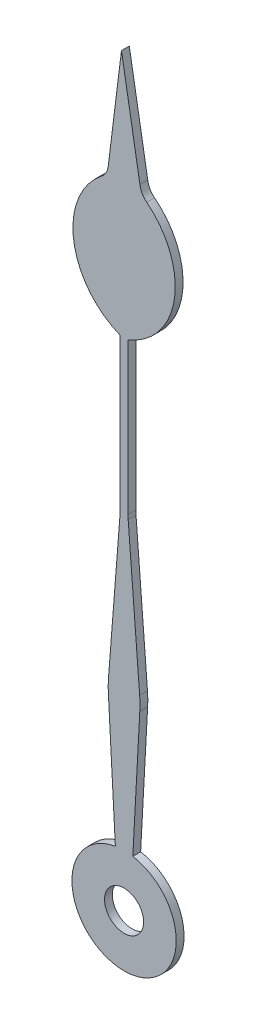
ISO-10303-21;
HEADER;
FILE_DESCRIPTION(('STEP AP214'),'2;1');
FILE_NAME('part.step','',(''),(''),'','','');
FILE_SCHEMA(('AUTOMOTIVE_DESIGN { 1 0 10303 214 1 1 1 1 }'));
ENDSEC;
DATA;
#1=APPLICATION_CONTEXT('core data for automotive mechanical design processes');
#2=APPLICATION_PROTOCOL_DEFINITION('international standard','automotive_design',2000,#1);
#3=PRODUCT_CONTEXT('',#1,'mechanical');
#4=PRODUCT('Part','Part','',(#3));
#5=PRODUCT_RELATED_PRODUCT_CATEGORY('part','',(#4));
#6=PRODUCT_DEFINITION_FORMATION('','',#4);
#7=PRODUCT_DEFINITION_CONTEXT('part definition',#1,'design');
#8=PRODUCT_DEFINITION('design','',#6,#7);
#9=PRODUCT_DEFINITION_SHAPE('','',#8);
#10=(LENGTH_UNIT() NAMED_UNIT(*) SI_UNIT(.MILLI.,.METRE.));
#11=(NAMED_UNIT(*) PLANE_ANGLE_UNIT() SI_UNIT($,.RADIAN.));
#12=(NAMED_UNIT(*) SI_UNIT($,.STERADIAN.) SOLID_ANGLE_UNIT());
#13=UNCERTAINTY_MEASURE_WITH_UNIT(LENGTH_MEASURE(1.E-05),#10,'distance_accuracy_value','');
#14=(GEOMETRIC_REPRESENTATION_CONTEXT(3) GLOBAL_UNCERTAINTY_ASSIGNED_CONTEXT((#13)) GLOBAL_UNIT_ASSIGNED_CONTEXT((#10,
#11,#12)) REPRESENTATION_CONTEXT('',''));
#15=CARTESIAN_POINT('',(0.,0.,0.));
#16=DIRECTION('',(0.,0.,1.));
#17=DIRECTION('',(1.,0.,0.));
#18=AXIS2_PLACEMENT_3D('',#15,#16,#17);
#19=CARTESIAN_POINT('',(0.,0.,0.3));
#20=DIRECTION('',(0.,0.,1.));
#21=DIRECTION('',(1.,0.,0.));
#22=AXIS2_PLACEMENT_3D('',#19,#20,#21);
#23=PLANE('',#22);
#24=CARTESIAN_POINT('',(0.,0.,0.3));
#25=DIRECTION('',(0.,0.,1.));
#26=DIRECTION('',(1.,0.,0.));
#27=AXIS2_PLACEMENT_3D('',#24,#25,#26);
#28=CIRCLE('',#27,2.);
#29=CARTESIAN_POINT('',(-0.33432381716244,1.9718589161697,0.3));
#30=VERTEX_POINT('',#29);
#31=CARTESIAN_POINT('',(0.33432381716244,1.9718589161697,0.3));
#32=VERTEX_POINT('',#31);
#33=EDGE_CURVE('E216',#30,#32,#28,.T.);
#34=ORIENTED_EDGE('',*,*,#33,.T.);
#35=DIRECTION('',(0.0542131918948308,0.998529383555924,0.));
#36=VECTOR('',#35,1.);
#37=CARTESIAN_POINT('',(0.33432381716244,1.9718589161697,0.3));
#38=LINE('',#37,#36);
#39=CARTESIAN_POINT('',(0.602966855412922,6.9198790936428,0.3));
#40=VERTEX_POINT('',#39);
#41=EDGE_CURVE('E119',#32,#40,#38,.T.);
#42=ORIENTED_EDGE('',*,*,#41,.T.);
#43=CARTESIAN_POINT('',(-3.39115067881078,7.13673186122212,0.3));
#44=DIRECTION('',(0.,0.,1.));
#45=DIRECTION('',(1.,0.,0.));
#46=AXIS2_PLACEMENT_3D('',#43,#44,#45);
#47=CIRCLE('',#46,4.);
#48=CARTESIAN_POINT('',(0.596611596726553,7.4493850777438,0.3));
#49=VERTEX_POINT('',#48);
#50=EDGE_CURVE('E258',#40,#49,#47,.T.);
#51=ORIENTED_EDGE('',*,*,#50,.T.);
#52=DIRECTION('',(-0.0781633041304199,0.996940568884332,0.));
#53=VECTOR('',#52,1.);
#54=CARTESIAN_POINT('',(0.596611596726553,7.4493850777438,0.3));
#55=LINE('',#54,#53);
#56=CARTESIAN_POINT('',(0.156118862231336,13.0676874538094,0.3));
#57=VERTEX_POINT('',#56);
#58=EDGE_CURVE('E277',#49,#57,#55,.T.);
#59=ORIENTED_EDGE('',*,*,#58,.T.);
#60=CARTESIAN_POINT('',(2.15,13.2240140620702,0.3));
#61=DIRECTION('',(0.,0.,-1.));
#62=DIRECTION('',(-1.,0.,0.));
#63=AXIS2_PLACEMENT_3D('',#60,#61,#62);
#64=CIRCLE('',#63,2.);
#65=CARTESIAN_POINT('',(0.15,13.2240140620702,0.3));
#66=VERTEX_POINT('',#65);
#67=EDGE_CURVE('E274',#57,#66,#64,.T.);
#68=ORIENTED_EDGE('',*,*,#67,.T.);
#69=DIRECTION('',(0.,1.,0.));
#70=VECTOR('',#69,1.);
#71=CARTESIAN_POINT('',(0.15,13.2240140620702,0.3));
#72=LINE('',#71,#70);
#73=CARTESIAN_POINT('',(0.149999999999999,19.0263409535599,0.3));
#74=VERTEX_POINT('',#73);
#75=EDGE_CURVE('E276',#66,#74,#72,.T.);
#76=ORIENTED_EDGE('',*,*,#75,.T.);
#77=CARTESIAN_POINT('',(-0.91243211149733,21.6960404063613,0.3));
#78=DIRECTION('',(0.,0.,1.));
#79=DIRECTION('',(1.,0.,0.));
#80=AXIS2_PLACEMENT_3D('',#77,#78,#79);
#81=CIRCLE('',#80,2.87333554598641);
#82=CARTESIAN_POINT('',(0.868120306497028,23.9511879063274,0.3));
#83=VERTEX_POINT('',#82);
#84=EDGE_CURVE('E279',#74,#83,#81,.T.);
#85=ORIENTED_EDGE('',*,*,#84,.T.);
#86=CARTESIAN_POINT('',(1.30189724366577,24.5005853660781,0.3));
#87=DIRECTION('',(0.,0.,-1.));
#88=DIRECTION('',(-1.,0.,0.));
#89=AXIS2_PLACEMENT_3D('',#86,#87,#88);
#90=CIRCLE('',#89,0.700000000000001);
#91=CARTESIAN_POINT('',(0.607202000046279,24.4145707249264,0.3));
#92=VERTEX_POINT('',#91);
#93=EDGE_CURVE('E285',#83,#92,#90,.T.);
#94=ORIENTED_EDGE('',*,*,#93,.T.);
#95=DIRECTION('',(-0.170467966477735,0.985363218516373,0.));
#96=VECTOR('',#95,1.);
#97=CARTESIAN_POINT('',(0.607202000046279,24.4145707249264,0.3));
#98=LINE('',#97,#96);
#99=CARTESIAN_POINT('',(-0.100615971359812,28.5060009733158,0.3));
#100=VERTEX_POINT('',#99);
#101=EDGE_CURVE('E287',#92,#100,#98,.T.);
#102=ORIENTED_EDGE('',*,*,#101,.T.);
#103=DIRECTION('',(-0.122878058788195,-0.992421776599267,0.));
#104=VECTOR('',#103,1.);
#105=CARTESIAN_POINT('',(-0.607202000046279,24.4145707249264,0.3));
#106=LINE('',#105,#104);
#107=CARTESIAN_POINT('',(-0.607202000046278,24.4145707249264,0.3));
#108=VERTEX_POINT('',#107);
#109=EDGE_CURVE('E289',#100,#108,#106,.T.);
#110=ORIENTED_EDGE('',*,*,#109,.T.);
#111=CARTESIAN_POINT('',(-1.30189724366577,24.5005853660781,0.3));
#112=DIRECTION('',(0.,0.,-1.));
#113=DIRECTION('',(1.,0.,0.));
#114=AXIS2_PLACEMENT_3D('',#111,#112,#113);
#115=CIRCLE('',#114,0.700000000000001);
#116=CARTESIAN_POINT('',(-0.868120306497027,23.9511879063274,0.3));
#117=VERTEX_POINT('',#116);
#118=EDGE_CURVE('E291',#108,#117,#115,.T.);
#119=ORIENTED_EDGE('',*,*,#118,.T.);
#120=CARTESIAN_POINT('',(0.91243211149733,21.6960404063613,0.3));
#121=DIRECTION('',(0.,0.,1.));
#122=DIRECTION('',(-1.,0.,0.));
#123=AXIS2_PLACEMENT_3D('',#120,#121,#122);
#124=CIRCLE('',#123,2.87333554598641);
#125=CARTESIAN_POINT('',(-0.15,19.0263409535599,0.3));
#126=VERTEX_POINT('',#125);
#127=EDGE_CURVE('E293',#117,#126,#124,.T.);
#128=ORIENTED_EDGE('',*,*,#127,.T.);
#129=DIRECTION('',(0.,-1.,0.));
#130=VECTOR('',#129,1.);
#131=CARTESIAN_POINT('',(-0.15,13.2240140620702,0.3));
#132=LINE('',#131,#130);
#133=CARTESIAN_POINT('',(-0.15,13.2240140620702,0.3));
#134=VERTEX_POINT('',#133);
#135=EDGE_CURVE('E295',#126,#134,#132,.T.);
#136=ORIENTED_EDGE('',*,*,#135,.T.);
#137=CARTESIAN_POINT('',(-2.15,13.2240140620702,0.3));
#138=DIRECTION('',(0.,0.,-1.));
#139=DIRECTION('',(1.,0.,0.));
#140=AXIS2_PLACEMENT_3D('',#137,#138,#139);
#141=CIRCLE('',#140,2.);
#142=CARTESIAN_POINT('',(-0.156118862231336,13.0676874538094,0.3));
#143=VERTEX_POINT('',#142);
#144=EDGE_CURVE('E165',#134,#143,#141,.T.);
#145=ORIENTED_EDGE('',*,*,#144,.T.);
#146=DIRECTION('',(-0.0781633041304199,-0.996940568884332,0.));
#147=VECTOR('',#146,1.);
#148=CARTESIAN_POINT('',(-0.596611596726553,7.4493850777438,0.3));
#149=LINE('',#148,#147);
#150=CARTESIAN_POINT('',(-0.596611596726553,7.4493850777438,0.3));
#151=VERTEX_POINT('',#150);
#152=EDGE_CURVE('E159',#143,#151,#149,.T.);
#153=ORIENTED_EDGE('',*,*,#152,.T.);
#154=CARTESIAN_POINT('',(3.39115067881078,7.13673186122212,0.3));
#155=DIRECTION('',(0.,0.,1.));
#156=DIRECTION('',(-1.,0.,0.));
#157=AXIS2_PLACEMENT_3D('',#154,#155,#156);
#158=CIRCLE('',#157,4.);
#159=CARTESIAN_POINT('',(-0.602966855412922,6.9198790936428,0.3));
#160=VERTEX_POINT('',#159);
#161=EDGE_CURVE('E163',#151,#160,#158,.T.);
#162=ORIENTED_EDGE('',*,*,#161,.T.);
#163=DIRECTION('',(0.0542131918948308,-0.998529383555924,0.));
#164=VECTOR('',#163,1.);
#165=CARTESIAN_POINT('',(-0.33432381716244,1.9718589161697,0.3));
#166=LINE('',#165,#164);
#167=EDGE_CURVE('E49',#160,#30,#166,.T.);
#168=ORIENTED_EDGE('',*,*,#167,.T.);
#169=EDGE_LOOP('',(#34,#42,#51,#59,#68,#76,#85,#94,#102,#110,#119,#128,#136,#145,#153,#162,#168));
#170=FACE_BOUND('',#169,.T.);
#171=CARTESIAN_POINT('',(0.,0.,0.3));
#172=DIRECTION('',(0.,0.,1.));
#173=DIRECTION('',(1.,0.,0.));
#174=AXIS2_PLACEMENT_3D('',#171,#172,#173);
#175=CIRCLE('',#174,0.75);
#176=CARTESIAN_POINT('',(0.75,0.,0.3));
#177=VERTEX_POINT('',#176);
#178=EDGE_CURVE('E187',#177,#177,#175,.T.);
#179=ORIENTED_EDGE('',*,*,#178,.F.);
#180=EDGE_LOOP('',(#179));
#181=FACE_BOUND('',#180,.T.);
#182=ADVANCED_FACE('F32',(#170,#181),#23,.T.);
#183=CARTESIAN_POINT('',(0.,0.,0.));
#184=DIRECTION('',(0.,0.,1.));
#185=DIRECTION('',(1.,0.,0.));
#186=AXIS2_PLACEMENT_3D('',#183,#184,#185);
#187=PLANE('',#186);
#188=CARTESIAN_POINT('',(0.,0.,0.));
#189=DIRECTION('',(0.,0.,1.));
#190=DIRECTION('',(1.,0.,0.));
#191=AXIS2_PLACEMENT_3D('',#188,#189,#190);
#192=CIRCLE('',#191,2.);
#193=CARTESIAN_POINT('',(-0.33432381716244,1.9718589161697,0.));
#194=VERTEX_POINT('',#193);
#195=CARTESIAN_POINT('',(0.33432381716244,1.9718589161697,0.));
#196=VERTEX_POINT('',#195);
#197=EDGE_CURVE('E183',#194,#196,#192,.T.);
#198=ORIENTED_EDGE('',*,*,#197,.F.);
#199=DIRECTION('',(0.0542131918948308,-0.998529383555924,0.));
#200=VECTOR('',#199,1.);
#201=CARTESIAN_POINT('',(-0.33432381716244,1.9718589161697,0.));
#202=LINE('',#201,#200);
#203=CARTESIAN_POINT('',(-0.602966855412922,6.9198790936428,0.));
#204=VERTEX_POINT('',#203);
#205=EDGE_CURVE('E111',#204,#194,#202,.T.);
#206=ORIENTED_EDGE('',*,*,#205,.F.);
#207=CARTESIAN_POINT('',(3.39115067881078,7.13673186122212,0.));
#208=DIRECTION('',(0.,0.,1.));
#209=DIRECTION('',(-1.,0.,0.));
#210=AXIS2_PLACEMENT_3D('',#207,#208,#209);
#211=CIRCLE('',#210,4.);
#212=CARTESIAN_POINT('',(-0.596611596726553,7.4493850777438,0.));
#213=VERTEX_POINT('',#212);
#214=EDGE_CURVE('E105',#213,#204,#211,.T.);
#215=ORIENTED_EDGE('',*,*,#214,.F.);
#216=DIRECTION('',(-0.0781633041304199,-0.996940568884332,0.));
#217=VECTOR('',#216,1.);
#218=CARTESIAN_POINT('',(-0.596611596726553,7.4493850777438,0.));
#219=LINE('',#218,#217);
#220=CARTESIAN_POINT('',(-0.156118862231336,13.0676874538094,0.));
#221=VERTEX_POINT('',#220);
#222=EDGE_CURVE('E173',#221,#213,#219,.T.);
#223=ORIENTED_EDGE('',*,*,#222,.F.);
#224=CARTESIAN_POINT('',(-2.15,13.2240140620702,0.));
#225=DIRECTION('',(0.,0.,-1.));
#226=DIRECTION('',(1.,0.,0.));
#227=AXIS2_PLACEMENT_3D('',#224,#225,#226);
#228=CIRCLE('',#227,2.);
#229=CARTESIAN_POINT('',(-0.15,13.2240140620702,0.));
#230=VERTEX_POINT('',#229);
#231=EDGE_CURVE('E211',#230,#221,#228,.T.);
#232=ORIENTED_EDGE('',*,*,#231,.F.);
#233=DIRECTION('',(0.,-1.,0.));
#234=VECTOR('',#233,1.);
#235=CARTESIAN_POINT('',(-0.15,13.2240140620702,0.));
#236=LINE('',#235,#234);
#237=CARTESIAN_POINT('',(-0.15,19.0263409535599,0.));
#238=VERTEX_POINT('',#237);
#239=EDGE_CURVE('E209',#238,#230,#236,.T.);
#240=ORIENTED_EDGE('',*,*,#239,.F.);
#241=CARTESIAN_POINT('',(0.91243211149733,21.6960404063613,0.));
#242=DIRECTION('',(0.,0.,1.));
#243=DIRECTION('',(-1.,0.,0.));
#244=AXIS2_PLACEMENT_3D('',#241,#242,#243);
#245=CIRCLE('',#244,2.87333554598641);
#246=CARTESIAN_POINT('',(-0.868120306497027,23.9511879063274,0.));
#247=VERTEX_POINT('',#246);
#248=EDGE_CURVE('E207',#247,#238,#245,.T.);
#249=ORIENTED_EDGE('',*,*,#248,.F.);
#250=CARTESIAN_POINT('',(-1.30189724366577,24.5005853660781,0.));
#251=DIRECTION('',(0.,0.,-1.));
#252=DIRECTION('',(1.,0.,0.));
#253=AXIS2_PLACEMENT_3D('',#250,#251,#252);
#254=CIRCLE('',#253,0.700000000000001);
#255=CARTESIAN_POINT('',(-0.607202000046278,24.4145707249264,0.));
#256=VERTEX_POINT('',#255);
#257=EDGE_CURVE('E205',#256,#247,#254,.T.);
#258=ORIENTED_EDGE('',*,*,#257,.F.);
#259=DIRECTION('',(-0.122878058788195,-0.992421776599267,0.));
#260=VECTOR('',#259,1.);
#261=CARTESIAN_POINT('',(-0.607202000046279,24.4145707249264,0.));
#262=LINE('',#261,#260);
#263=CARTESIAN_POINT('',(-0.100615971359812,28.5060009733158,0.));
#264=VERTEX_POINT('',#263);
#265=EDGE_CURVE('E203',#264,#256,#262,.T.);
#266=ORIENTED_EDGE('',*,*,#265,.F.);
#267=DIRECTION('',(-0.170467966477735,0.985363218516373,0.));
#268=VECTOR('',#267,1.);
#269=CARTESIAN_POINT('',(0.607202000046279,24.4145707249264,0.));
#270=LINE('',#269,#268);
#271=CARTESIAN_POINT('',(0.607202000046279,24.4145707249264,0.));
#272=VERTEX_POINT('',#271);
#273=EDGE_CURVE('E201',#272,#264,#270,.T.);
#274=ORIENTED_EDGE('',*,*,#273,.F.);
#275=CARTESIAN_POINT('',(1.30189724366577,24.5005853660781,0.));
#276=DIRECTION('',(0.,0.,-1.));
#277=DIRECTION('',(-1.,0.,0.));
#278=AXIS2_PLACEMENT_3D('',#275,#276,#277);
#279=CIRCLE('',#278,0.700000000000001);
#280=CARTESIAN_POINT('',(0.868120306497028,23.9511879063274,0.));
#281=VERTEX_POINT('',#280);
#282=EDGE_CURVE('E199',#281,#272,#279,.T.);
#283=ORIENTED_EDGE('',*,*,#282,.F.);
#284=CARTESIAN_POINT('',(-0.91243211149733,21.6960404063613,0.));
#285=DIRECTION('',(0.,0.,1.));
#286=DIRECTION('',(1.,0.,0.));
#287=AXIS2_PLACEMENT_3D('',#284,#285,#286);
#288=CIRCLE('',#287,2.87333554598641);
#289=CARTESIAN_POINT('',(0.149999999999999,19.0263409535599,0.));
#290=VERTEX_POINT('',#289);
#291=EDGE_CURVE('E197',#290,#281,#288,.T.);
#292=ORIENTED_EDGE('',*,*,#291,.F.);
#293=DIRECTION('',(0.,1.,0.));
#294=VECTOR('',#293,1.);
#295=CARTESIAN_POINT('',(0.15,13.2240140620702,0.));
#296=LINE('',#295,#294);
#297=CARTESIAN_POINT('',(0.15,13.2240140620702,0.));
#298=VERTEX_POINT('',#297);
#299=EDGE_CURVE('E195',#298,#290,#296,.T.);
#300=ORIENTED_EDGE('',*,*,#299,.F.);
#301=CARTESIAN_POINT('',(2.15,13.2240140620702,0.));
#302=DIRECTION('',(0.,0.,-1.));
#303=DIRECTION('',(-1.,0.,0.));
#304=AXIS2_PLACEMENT_3D('',#301,#302,#303);
#305=CIRCLE('',#304,2.);
#306=CARTESIAN_POINT('',(0.156118862231336,13.0676874538094,0.));
#307=VERTEX_POINT('',#306);
#308=EDGE_CURVE('E193',#307,#298,#305,.T.);
#309=ORIENTED_EDGE('',*,*,#308,.F.);
#310=DIRECTION('',(-0.0781633041304199,0.996940568884332,0.));
#311=VECTOR('',#310,1.);
#312=CARTESIAN_POINT('',(0.596611596726553,7.4493850777438,0.));
#313=LINE('',#312,#311);
#314=CARTESIAN_POINT('',(0.596611596726553,7.4493850777438,0.));
#315=VERTEX_POINT('',#314);
#316=EDGE_CURVE('E191',#315,#307,#313,.T.);
#317=ORIENTED_EDGE('',*,*,#316,.F.);
#318=CARTESIAN_POINT('',(-3.39115067881078,7.13673186122212,0.));
#319=DIRECTION('',(0.,0.,1.));
#320=DIRECTION('',(1.,0.,0.));
#321=AXIS2_PLACEMENT_3D('',#318,#319,#320);
#322=CIRCLE('',#321,4.);
#323=CARTESIAN_POINT('',(0.602966855412922,6.9198790936428,0.));
#324=VERTEX_POINT('',#323);
#325=EDGE_CURVE('E189',#324,#315,#322,.T.);
#326=ORIENTED_EDGE('',*,*,#325,.F.);
#327=DIRECTION('',(0.0542131918948308,0.998529383555924,0.));
#328=VECTOR('',#327,1.);
#329=CARTESIAN_POINT('',(0.33432381716244,1.9718589161697,0.));
#330=LINE('',#329,#328);
#331=EDGE_CURVE('E186',#196,#324,#330,.T.);
#332=ORIENTED_EDGE('',*,*,#331,.F.);
#333=EDGE_LOOP('',(#198,#206,#215,#223,#232,#240,#249,#258,#266,#274,#283,#292,#300,#309,#317,
#326,#332));
#334=FACE_BOUND('',#333,.T.);
#335=CARTESIAN_POINT('',(0.,0.,0.));
#336=DIRECTION('',(0.,0.,1.));
#337=DIRECTION('',(1.,0.,0.));
#338=AXIS2_PLACEMENT_3D('',#335,#336,#337);
#339=CIRCLE('',#338,0.75);
#340=CARTESIAN_POINT('',(0.75,0.,0.));
#341=VERTEX_POINT('',#340);
#342=EDGE_CURVE('E507',#341,#341,#339,.T.);
#343=ORIENTED_EDGE('',*,*,#342,.T.);
#344=EDGE_LOOP('',(#343));
#345=FACE_BOUND('',#344,.T.);
#346=ADVANCED_FACE('F262',(#334,#345),#187,.F.);
#347=CARTESIAN_POINT('',(0.,0.,0.3));
#348=DIRECTION('',(0.,0.,-1.));
#349=DIRECTION('',(-1.,0.,0.));
#350=AXIS2_PLACEMENT_3D('',#347,#348,#349);
#351=CYLINDRICAL_SURFACE('',#350,2.);
#352=ORIENTED_EDGE('',*,*,#197,.T.);
#353=DIRECTION('',(0.,0.,-1.));
#354=VECTOR('',#353,1.);
#355=CARTESIAN_POINT('',(0.33432381716244,1.9718589161697,0.3));
#356=LINE('',#355,#354);
#357=EDGE_CURVE('E11',#32,#196,#356,.T.);
#358=ORIENTED_EDGE('',*,*,#357,.F.);
#359=ORIENTED_EDGE('',*,*,#33,.F.);
#360=DIRECTION('',(0.,0.,-1.));
#361=VECTOR('',#360,1.);
#362=CARTESIAN_POINT('',(-0.33432381716244,1.9718589161697,0.3));
#363=LINE('',#362,#361);
#364=EDGE_CURVE('E179',#30,#194,#363,.T.);
#365=ORIENTED_EDGE('',*,*,#364,.T.);
#366=EDGE_LOOP('',(#352,#358,#359,#365));
#367=FACE_BOUND('',#366,.T.);
#368=ADVANCED_FACE('F34',(#367),#351,.T.);
#369=CARTESIAN_POINT('',(0.33432381716244,1.9718589161697,0.3));
#370=DIRECTION('',(-0.998529383555924,0.0542131918948308,0.));
#371=DIRECTION('',(-0.0542131918948308,-0.998529383555924,0.));
#372=AXIS2_PLACEMENT_3D('',#369,#370,#371);
#373=PLANE('',#372);
#374=ORIENTED_EDGE('',*,*,#331,.T.);
#375=DIRECTION('',(0.,0.,-1.));
#376=VECTOR('',#375,1.);
#377=CARTESIAN_POINT('',(0.602966855412922,6.9198790936428,0.3));
#378=LINE('',#377,#376);
#379=EDGE_CURVE('E41',#40,#324,#378,.T.);
#380=ORIENTED_EDGE('',*,*,#379,.F.);
#381=ORIENTED_EDGE('',*,*,#41,.F.);
#382=ORIENTED_EDGE('',*,*,#357,.T.);
#383=EDGE_LOOP('',(#374,#380,#381,#382));
#384=FACE_BOUND('',#383,.T.);
#385=ADVANCED_FACE('F329',(#384),#373,.F.);
#386=CARTESIAN_POINT('',(-3.39115067881078,7.13673186122212,0.3));
#387=DIRECTION('',(0.,0.,-1.));
#388=DIRECTION('',(-1.,0.,0.));
#389=AXIS2_PLACEMENT_3D('',#386,#387,#388);
#390=CYLINDRICAL_SURFACE('',#389,4.);
#391=ORIENTED_EDGE('',*,*,#325,.T.);
#392=DIRECTION('',(0.,0.,-1.));
#393=VECTOR('',#392,1.);
#394=CARTESIAN_POINT('',(0.596611596726553,7.4493850777438,0.3));
#395=LINE('',#394,#393);
#396=EDGE_CURVE('E250',#49,#315,#395,.T.);
#397=ORIENTED_EDGE('',*,*,#396,.F.);
#398=ORIENTED_EDGE('',*,*,#50,.F.);
#399=ORIENTED_EDGE('',*,*,#379,.T.);
#400=EDGE_LOOP('',(#391,#397,#398,#399));
#401=FACE_BOUND('',#400,.T.);
#402=ADVANCED_FACE('F256',(#401),#390,.T.);
#403=CARTESIAN_POINT('',(0.596611596726553,7.4493850777438,0.3));
#404=DIRECTION('',(-0.996940568884332,-0.0781633041304199,0.));
#405=DIRECTION('',(0.0781633041304199,-0.996940568884332,0.));
#406=AXIS2_PLACEMENT_3D('',#403,#404,#405);
#407=PLANE('',#406);
#408=ORIENTED_EDGE('',*,*,#316,.T.);
#409=DIRECTION('',(0.,0.,-1.));
#410=VECTOR('',#409,1.);
#411=CARTESIAN_POINT('',(0.156118862231336,13.0676874538094,0.3));
#412=LINE('',#411,#410);
#413=EDGE_CURVE('E247',#57,#307,#412,.T.);
#414=ORIENTED_EDGE('',*,*,#413,.F.);
#415=ORIENTED_EDGE('',*,*,#58,.F.);
#416=ORIENTED_EDGE('',*,*,#396,.T.);
#417=EDGE_LOOP('',(#408,#414,#415,#416));
#418=FACE_BOUND('',#417,.T.);
#419=ADVANCED_FACE('F268',(#418),#407,.F.);
#420=CARTESIAN_POINT('',(2.15,13.2240140620702,0.3));
#421=DIRECTION('',(0.,0.,-1.));
#422=DIRECTION('',(-1.,0.,0.));
#423=AXIS2_PLACEMENT_3D('',#420,#421,#422);
#424=CYLINDRICAL_SURFACE('',#423,2.);
#425=ORIENTED_EDGE('',*,*,#308,.T.);
#426=DIRECTION('',(0.,0.,-1.));
#427=VECTOR('',#426,1.);
#428=CARTESIAN_POINT('',(0.15,13.2240140620702,0.3));
#429=LINE('',#428,#427);
#430=EDGE_CURVE('E244',#66,#298,#429,.T.);
#431=ORIENTED_EDGE('',*,*,#430,.F.);
#432=ORIENTED_EDGE('',*,*,#67,.F.);
#433=ORIENTED_EDGE('',*,*,#413,.T.);
#434=EDGE_LOOP('',(#425,#431,#432,#433));
#435=FACE_BOUND('',#434,.T.);
#436=ADVANCED_FACE('F272',(#435),#424,.F.);
#437=CARTESIAN_POINT('',(0.15,13.2240140620702,0.3));
#438=DIRECTION('',(-1.,0.,0.));
#439=DIRECTION('',(0.,-1.,0.));
#440=AXIS2_PLACEMENT_3D('',#437,#438,#439);
#441=PLANE('',#440);
#442=ORIENTED_EDGE('',*,*,#299,.T.);
#443=DIRECTION('',(0.,0.,-1.));
#444=VECTOR('',#443,1.);
#445=CARTESIAN_POINT('',(0.149999999999999,19.0263409535599,0.3));
#446=LINE('',#445,#444);
#447=EDGE_CURVE('E241',#74,#290,#446,.T.);
#448=ORIENTED_EDGE('',*,*,#447,.F.);
#449=ORIENTED_EDGE('',*,*,#75,.F.);
#450=ORIENTED_EDGE('',*,*,#430,.T.);
#451=EDGE_LOOP('',(#442,#448,#449,#450));
#452=FACE_BOUND('',#451,.T.);
#453=ADVANCED_FACE('F342',(#452),#441,.F.);
#454=CARTESIAN_POINT('',(-0.91243211149733,21.6960404063613,0.3));
#455=DIRECTION('',(0.,0.,-1.));
#456=DIRECTION('',(-1.,0.,0.));
#457=AXIS2_PLACEMENT_3D('',#454,#455,#456);
#458=CYLINDRICAL_SURFACE('',#457,2.87333554598641);
#459=ORIENTED_EDGE('',*,*,#291,.T.);
#460=DIRECTION('',(0.,0.,-1.));
#461=VECTOR('',#460,1.);
#462=CARTESIAN_POINT('',(0.868120306497028,23.9511879063274,0.3));
#463=LINE('',#462,#461);
#464=EDGE_CURVE('E238',#83,#281,#463,.T.);
#465=ORIENTED_EDGE('',*,*,#464,.F.);
#466=ORIENTED_EDGE('',*,*,#84,.F.);
#467=ORIENTED_EDGE('',*,*,#447,.T.);
#468=EDGE_LOOP('',(#459,#465,#466,#467));
#469=FACE_BOUND('',#468,.T.);
#470=ADVANCED_FACE('F345',(#469),#458,.T.);
#471=CARTESIAN_POINT('',(1.30189724366577,24.5005853660781,0.3));
#472=DIRECTION('',(0.,0.,-1.));
#473=DIRECTION('',(-1.,0.,0.));
#474=AXIS2_PLACEMENT_3D('',#471,#472,#473);
#475=CYLINDRICAL_SURFACE('',#474,0.700000000000001);
#476=ORIENTED_EDGE('',*,*,#282,.T.);
#477=DIRECTION('',(0.,0.,-1.));
#478=VECTOR('',#477,1.);
#479=CARTESIAN_POINT('',(0.607202000046279,24.4145707249264,0.3));
#480=LINE('',#479,#478);
#481=EDGE_CURVE('E235',#92,#272,#480,.T.);
#482=ORIENTED_EDGE('',*,*,#481,.F.);
#483=ORIENTED_EDGE('',*,*,#93,.F.);
#484=ORIENTED_EDGE('',*,*,#464,.T.);
#485=EDGE_LOOP('',(#476,#482,#483,#484));
#486=FACE_BOUND('',#485,.T.);
#487=ADVANCED_FACE('F349',(#486),#475,.F.);
#488=CARTESIAN_POINT('',(0.607202000046279,24.4145707249264,0.3));
#489=DIRECTION('',(-0.985363218516373,-0.170467966477735,0.));
#490=DIRECTION('',(0.170467966477735,-0.985363218516373,0.));
#491=AXIS2_PLACEMENT_3D('',#488,#489,#490);
#492=PLANE('',#491);
#493=ORIENTED_EDGE('',*,*,#273,.T.);
#494=DIRECTION('',(0.,0.,-1.));
#495=VECTOR('',#494,1.);
#496=CARTESIAN_POINT('',(-0.100615971359812,28.5060009733158,0.3));
#497=LINE('',#496,#495);
#498=EDGE_CURVE('E232',#100,#264,#497,.T.);
#499=ORIENTED_EDGE('',*,*,#498,.F.);
#500=ORIENTED_EDGE('',*,*,#101,.F.);
#501=ORIENTED_EDGE('',*,*,#481,.T.);
#502=EDGE_LOOP('',(#493,#499,#500,#501));
#503=FACE_BOUND('',#502,.T.);
#504=ADVANCED_FACE('F353',(#503),#492,.F.);
#505=CARTESIAN_POINT('',(-0.607202000046279,24.4145707249264,0.3));
#506=DIRECTION('',(0.992421776599267,-0.122878058788195,0.));
#507=DIRECTION('',(0.122878058788195,0.992421776599267,0.));
#508=AXIS2_PLACEMENT_3D('',#505,#506,#507);
#509=PLANE('',#508);
#510=ORIENTED_EDGE('',*,*,#265,.T.);
#511=DIRECTION('',(0.,0.,-1.));
#512=VECTOR('',#511,1.);
#513=CARTESIAN_POINT('',(-0.607202000046278,24.4145707249264,0.3));
#514=LINE('',#513,#512);
#515=EDGE_CURVE('E229',#108,#256,#514,.T.);
#516=ORIENTED_EDGE('',*,*,#515,.F.);
#517=ORIENTED_EDGE('',*,*,#109,.F.);
#518=ORIENTED_EDGE('',*,*,#498,.T.);
#519=EDGE_LOOP('',(#510,#516,#517,#518));
#520=FACE_BOUND('',#519,.T.);
#521=ADVANCED_FACE('F357',(#520),#509,.F.);
#522=CARTESIAN_POINT('',(-1.30189724366577,24.5005853660781,0.3));
#523=DIRECTION('',(0.,0.,-1.));
#524=DIRECTION('',(-1.,0.,0.));
#525=AXIS2_PLACEMENT_3D('',#522,#523,#524);
#526=CYLINDRICAL_SURFACE('',#525,0.700000000000001);
#527=ORIENTED_EDGE('',*,*,#257,.T.);
#528=DIRECTION('',(0.,0.,-1.));
#529=VECTOR('',#528,1.);
#530=CARTESIAN_POINT('',(-0.868120306497027,23.9511879063274,0.3));
#531=LINE('',#530,#529);
#532=EDGE_CURVE('E226',#117,#247,#531,.T.);
#533=ORIENTED_EDGE('',*,*,#532,.F.);
#534=ORIENTED_EDGE('',*,*,#118,.F.);
#535=ORIENTED_EDGE('',*,*,#515,.T.);
#536=EDGE_LOOP('',(#527,#533,#534,#535));
#537=FACE_BOUND('',#536,.T.);
#538=ADVANCED_FACE('F361',(#537),#526,.F.);
#539=CARTESIAN_POINT('',(0.91243211149733,21.6960404063613,0.3));
#540=DIRECTION('',(0.,0.,-1.));
#541=DIRECTION('',(-1.,0.,0.));
#542=AXIS2_PLACEMENT_3D('',#539,#540,#541);
#543=CYLINDRICAL_SURFACE('',#542,2.87333554598641);
#544=ORIENTED_EDGE('',*,*,#248,.T.);
#545=DIRECTION('',(0.,0.,-1.));
#546=VECTOR('',#545,1.);
#547=CARTESIAN_POINT('',(-0.15,19.0263409535599,0.3));
#548=LINE('',#547,#546);
#549=EDGE_CURVE('E223',#126,#238,#548,.T.);
#550=ORIENTED_EDGE('',*,*,#549,.F.);
#551=ORIENTED_EDGE('',*,*,#127,.F.);
#552=ORIENTED_EDGE('',*,*,#532,.T.);
#553=EDGE_LOOP('',(#544,#550,#551,#552));
#554=FACE_BOUND('',#553,.T.);
#555=ADVANCED_FACE('F365',(#554),#543,.T.);
#556=CARTESIAN_POINT('',(-0.15,13.2240140620702,0.3));
#557=DIRECTION('',(1.,0.,0.));
#558=DIRECTION('',(0.,1.,0.));
#559=AXIS2_PLACEMENT_3D('',#556,#557,#558);
#560=PLANE('',#559);
#561=ORIENTED_EDGE('',*,*,#239,.T.);
#562=DIRECTION('',(0.,0.,-1.));
#563=VECTOR('',#562,1.);
#564=CARTESIAN_POINT('',(-0.15,13.2240140620702,0.3));
#565=LINE('',#564,#563);
#566=EDGE_CURVE('E220',#134,#230,#565,.T.);
#567=ORIENTED_EDGE('',*,*,#566,.F.);
#568=ORIENTED_EDGE('',*,*,#135,.F.);
#569=ORIENTED_EDGE('',*,*,#549,.T.);
#570=EDGE_LOOP('',(#561,#567,#568,#569));
#571=FACE_BOUND('',#570,.T.);
#572=ADVANCED_FACE('F301',(#571),#560,.F.);
#573=CARTESIAN_POINT('',(-2.15,13.2240140620702,0.3));
#574=DIRECTION('',(0.,0.,-1.));
#575=DIRECTION('',(-1.,0.,0.));
#576=AXIS2_PLACEMENT_3D('',#573,#574,#575);
#577=CYLINDRICAL_SURFACE('',#576,2.);
#578=ORIENTED_EDGE('',*,*,#231,.T.);
#579=DIRECTION('',(0.,0.,-1.));
#580=VECTOR('',#579,1.);
#581=CARTESIAN_POINT('',(-0.156118862231336,13.0676874538094,0.3));
#582=LINE('',#581,#580);
#583=EDGE_CURVE('E174',#143,#221,#582,.T.);
#584=ORIENTED_EDGE('',*,*,#583,.F.);
#585=ORIENTED_EDGE('',*,*,#144,.F.);
#586=ORIENTED_EDGE('',*,*,#566,.T.);
#587=EDGE_LOOP('',(#578,#584,#585,#586));
#588=FACE_BOUND('',#587,.T.);
#589=ADVANCED_FACE('F305',(#588),#577,.F.);
#590=CARTESIAN_POINT('',(-0.596611596726553,7.4493850777438,0.3));
#591=DIRECTION('',(0.996940568884332,-0.0781633041304199,0.));
#592=DIRECTION('',(0.0781633041304199,0.996940568884332,0.));
#593=AXIS2_PLACEMENT_3D('',#590,#591,#592);
#594=PLANE('',#593);
#595=ORIENTED_EDGE('',*,*,#222,.T.);
#596=DIRECTION('',(0.,0.,-1.));
#597=VECTOR('',#596,1.);
#598=CARTESIAN_POINT('',(-0.596611596726553,7.4493850777438,0.3));
#599=LINE('',#598,#597);
#600=EDGE_CURVE('E170',#151,#213,#599,.T.);
#601=ORIENTED_EDGE('',*,*,#600,.F.);
#602=ORIENTED_EDGE('',*,*,#152,.F.);
#603=ORIENTED_EDGE('',*,*,#583,.T.);
#604=EDGE_LOOP('',(#595,#601,#602,#603));
#605=FACE_BOUND('',#604,.T.);
#606=ADVANCED_FACE('F171',(#605),#594,.F.);
#607=CARTESIAN_POINT('',(3.39115067881078,7.13673186122212,0.3));
#608=DIRECTION('',(0.,0.,-1.));
#609=DIRECTION('',(-1.,0.,0.));
#610=AXIS2_PLACEMENT_3D('',#607,#608,#609);
#611=CYLINDRICAL_SURFACE('',#610,4.);
#612=ORIENTED_EDGE('',*,*,#214,.T.);
#613=DIRECTION('',(0.,0.,-1.));
#614=VECTOR('',#613,1.);
#615=CARTESIAN_POINT('',(-0.602966855412922,6.9198790936428,0.3));
#616=LINE('',#615,#614);
#617=EDGE_CURVE('E175',#160,#204,#616,.T.);
#618=ORIENTED_EDGE('',*,*,#617,.F.);
#619=ORIENTED_EDGE('',*,*,#161,.F.);
#620=ORIENTED_EDGE('',*,*,#600,.T.);
#621=EDGE_LOOP('',(#612,#618,#619,#620));
#622=FACE_BOUND('',#621,.T.);
#623=ADVANCED_FACE('F177',(#622),#611,.T.);
#624=CARTESIAN_POINT('',(-0.33432381716244,1.9718589161697,0.3));
#625=DIRECTION('',(0.998529383555924,0.0542131918948308,0.));
#626=DIRECTION('',(-0.0542131918948308,0.998529383555924,0.));
#627=AXIS2_PLACEMENT_3D('',#624,#625,#626);
#628=PLANE('',#627);
#629=ORIENTED_EDGE('',*,*,#205,.T.);
#630=ORIENTED_EDGE('',*,*,#364,.F.);
#631=ORIENTED_EDGE('',*,*,#167,.F.);
#632=ORIENTED_EDGE('',*,*,#617,.T.);
#633=EDGE_LOOP('',(#629,#630,#631,#632));
#634=FACE_BOUND('',#633,.T.);
#635=ADVANCED_FACE('F309',(#634),#628,.F.);
#636=CARTESIAN_POINT('',(0.,0.,0.3));
#637=DIRECTION('',(0.,0.,-1.));
#638=DIRECTION('',(-1.,0.,0.));
#639=AXIS2_PLACEMENT_3D('',#636,#637,#638);
#640=CYLINDRICAL_SURFACE('',#639,0.75);
#641=ORIENTED_EDGE('',*,*,#178,.T.);
#642=EDGE_LOOP('',(#641));
#643=FACE_BOUND('',#642,.T.);
#644=ORIENTED_EDGE('',*,*,#342,.F.);
#645=EDGE_LOOP('',(#644));
#646=FACE_BOUND('',#645,.T.);
#647=ADVANCED_FACE('F311',(#643,#646),#640,.F.);
#648=CLOSED_SHELL('',(#182,#346,#368,#385,#402,#419,#436,#453,#470,#487,#504,#521,#538,#555,
#572,#589,#606,#623,#635,#647));
#649=MANIFOLD_SOLID_BREP('B2',#648);
#650=ADVANCED_BREP_SHAPE_REPRESENTATION('',(#18,#649),#14);
#651=SHAPE_DEFINITION_REPRESENTATION(#9,#650);
ENDSEC;
END-ISO-10303-21;
